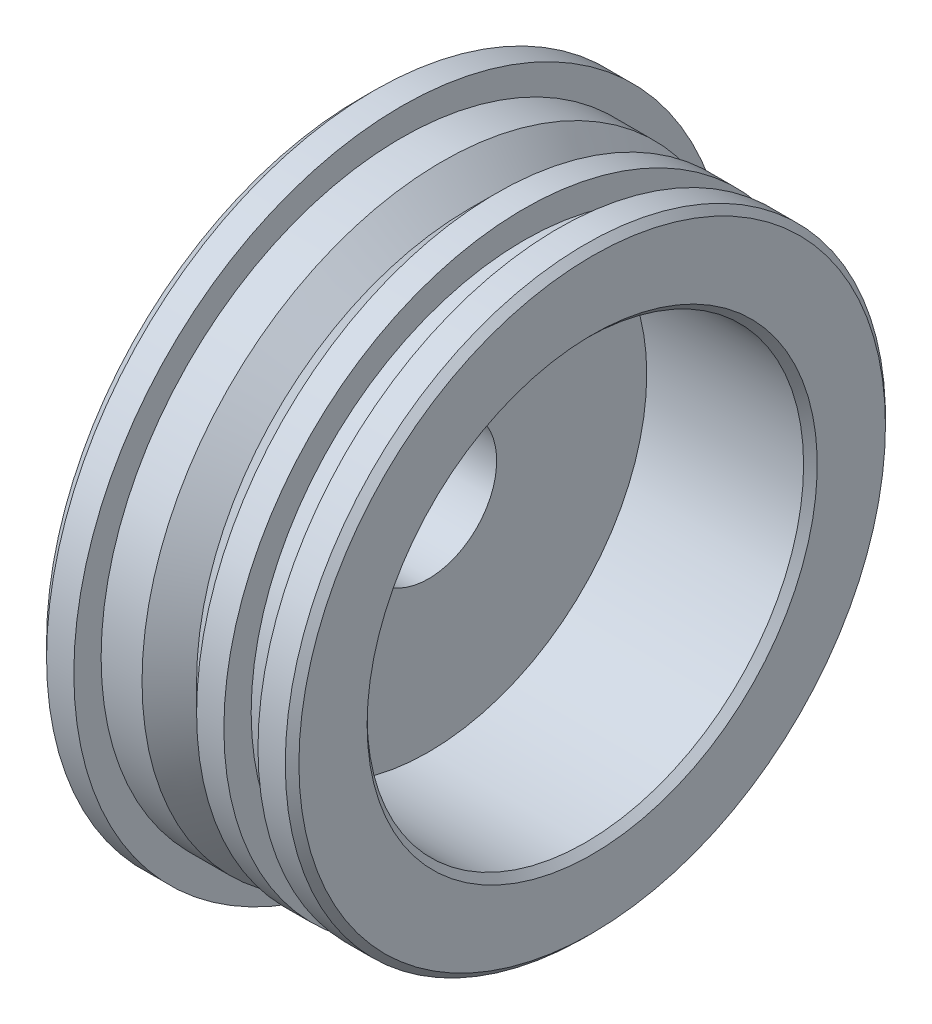
ISO-10303-21;
HEADER;
FILE_DESCRIPTION(('STEP AP214'),'2;1');
FILE_NAME('part.step','',(''),(''),'','','');
FILE_SCHEMA(('AUTOMOTIVE_DESIGN { 1 0 10303 214 1 1 1 1 }'));
ENDSEC;
DATA;
#1=APPLICATION_CONTEXT('core data for automotive mechanical design processes');
#2=APPLICATION_PROTOCOL_DEFINITION('international standard','automotive_design',2000,#1);
#3=PRODUCT_CONTEXT('',#1,'mechanical');
#4=PRODUCT('Part','Part','',(#3));
#5=PRODUCT_RELATED_PRODUCT_CATEGORY('part','',(#4));
#6=PRODUCT_DEFINITION_FORMATION('','',#4);
#7=PRODUCT_DEFINITION_CONTEXT('part definition',#1,'design');
#8=PRODUCT_DEFINITION('design','',#6,#7);
#9=PRODUCT_DEFINITION_SHAPE('','',#8);
#10=(LENGTH_UNIT() NAMED_UNIT(*) SI_UNIT(.MILLI.,.METRE.));
#11=(NAMED_UNIT(*) PLANE_ANGLE_UNIT() SI_UNIT($,.RADIAN.));
#12=(NAMED_UNIT(*) SI_UNIT($,.STERADIAN.) SOLID_ANGLE_UNIT());
#13=UNCERTAINTY_MEASURE_WITH_UNIT(LENGTH_MEASURE(1.E-05),#10,'distance_accuracy_value','');
#14=(GEOMETRIC_REPRESENTATION_CONTEXT(3) GLOBAL_UNCERTAINTY_ASSIGNED_CONTEXT((#13)) GLOBAL_UNIT_ASSIGNED_CONTEXT((#10,
#11,#12)) REPRESENTATION_CONTEXT('',''));
#15=CARTESIAN_POINT('',(0.,0.,0.));
#16=DIRECTION('',(0.,0.,1.));
#17=DIRECTION('',(1.,0.,0.));
#18=AXIS2_PLACEMENT_3D('',#15,#16,#17);
#19=CARTESIAN_POINT('',(-5.,0.,0.));
#20=DIRECTION('',(1.,0.,0.));
#21=DIRECTION('',(0.,0.,-1.));
#22=AXIS2_PLACEMENT_3D('',#19,#20,#21);
#23=PLANE('',#22);
#24=CARTESIAN_POINT('',(-5.,0.,0.));
#25=DIRECTION('',(-1.,0.,0.));
#26=DIRECTION('',(0.,0.,1.));
#27=AXIS2_PLACEMENT_3D('',#24,#25,#26);
#28=CIRCLE('',#27,5.);
#29=CARTESIAN_POINT('',(-5.,0.,5.));
#30=VERTEX_POINT('',#29);
#31=EDGE_CURVE('E90',#30,#30,#28,.T.);
#32=ORIENTED_EDGE('',*,*,#31,.F.);
#33=EDGE_LOOP('',(#32));
#34=FACE_BOUND('',#33,.T.);
#35=CARTESIAN_POINT('',(-5.,0.,0.));
#36=DIRECTION('',(-1.,0.,0.));
#37=DIRECTION('',(0.,0.,1.));
#38=AXIS2_PLACEMENT_3D('',#35,#36,#37);
#39=CIRCLE('',#38,23.);
#40=CARTESIAN_POINT('',(-5.,0.,23.));
#41=VERTEX_POINT('',#40);
#42=EDGE_CURVE('E10',#41,#41,#39,.T.);
#43=ORIENTED_EDGE('',*,*,#42,.T.);
#44=EDGE_LOOP('',(#43));
#45=FACE_BOUND('',#44,.T.);
#46=ADVANCED_FACE('F35',(#34,#45),#23,.F.);
#47=CARTESIAN_POINT('',(-4.,0.,0.));
#48=DIRECTION('',(1.,0.,0.));
#49=DIRECTION('',(0.,0.,-1.));
#50=AXIS2_PLACEMENT_3D('',#47,#48,#49);
#51=CONICAL_SURFACE('',#50,24.,0.785398163397449);
#52=ORIENTED_EDGE('',*,*,#42,.F.);
#53=EDGE_LOOP('',(#52));
#54=FACE_BOUND('',#53,.T.);
#55=CARTESIAN_POINT('',(-4.,0.,0.));
#56=DIRECTION('',(-1.,0.,0.));
#57=DIRECTION('',(0.,0.,1.));
#58=AXIS2_PLACEMENT_3D('',#55,#56,#57);
#59=CIRCLE('',#58,24.);
#60=CARTESIAN_POINT('',(-4.,0.,24.));
#61=VERTEX_POINT('',#60);
#62=EDGE_CURVE('E42',#61,#61,#59,.T.);
#63=ORIENTED_EDGE('',*,*,#62,.T.);
#64=EDGE_LOOP('',(#63));
#65=FACE_BOUND('',#64,.T.);
#66=ADVANCED_FACE('F109',(#54,#65),#51,.T.);
#67=CARTESIAN_POINT('',(0.,0.,0.));
#68=DIRECTION('',(-1.,0.,0.));
#69=DIRECTION('',(0.,0.,1.));
#70=AXIS2_PLACEMENT_3D('',#67,#68,#69);
#71=CYLINDRICAL_SURFACE('',#70,24.);
#72=ORIENTED_EDGE('',*,*,#62,.F.);
#73=EDGE_LOOP('',(#72));
#74=FACE_BOUND('',#73,.T.);
#75=CARTESIAN_POINT('',(-2.,0.,0.));
#76=DIRECTION('',(-1.,0.,0.));
#77=DIRECTION('',(0.,0.,1.));
#78=AXIS2_PLACEMENT_3D('',#75,#76,#77);
#79=CIRCLE('',#78,24.);
#80=CARTESIAN_POINT('',(-2.,0.,24.));
#81=VERTEX_POINT('',#80);
#82=EDGE_CURVE('E46',#81,#81,#79,.T.);
#83=ORIENTED_EDGE('',*,*,#82,.T.);
#84=EDGE_LOOP('',(#83));
#85=FACE_BOUND('',#84,.T.);
#86=ADVANCED_FACE('F114',(#74,#85),#71,.T.);
#87=CARTESIAN_POINT('',(-2.,24.,0.));
#88=DIRECTION('',(-1.,0.,0.));
#89=DIRECTION('',(0.,0.,1.));
#90=AXIS2_PLACEMENT_3D('',#87,#88,#89);
#91=PLANE('',#90);
#92=ORIENTED_EDGE('',*,*,#82,.F.);
#93=EDGE_LOOP('',(#92));
#94=FACE_BOUND('',#93,.T.);
#95=CARTESIAN_POINT('',(-2.,0.,0.));
#96=DIRECTION('',(-1.,0.,0.));
#97=DIRECTION('',(0.,0.,1.));
#98=AXIS2_PLACEMENT_3D('',#95,#96,#97);
#99=CIRCLE('',#98,22.);
#100=CARTESIAN_POINT('',(-2.,0.,22.));
#101=VERTEX_POINT('',#100);
#102=EDGE_CURVE('E51',#101,#101,#99,.T.);
#103=ORIENTED_EDGE('',*,*,#102,.T.);
#104=EDGE_LOOP('',(#103));
#105=FACE_BOUND('',#104,.T.);
#106=ADVANCED_FACE('F119',(#94,#105),#91,.F.);
#107=CARTESIAN_POINT('',(0.,0.,0.));
#108=DIRECTION('',(-1.,0.,0.));
#109=DIRECTION('',(0.,0.,1.));
#110=AXIS2_PLACEMENT_3D('',#107,#108,#109);
#111=CYLINDRICAL_SURFACE('',#110,22.);
#112=ORIENTED_EDGE('',*,*,#102,.F.);
#113=EDGE_LOOP('',(#112));
#114=FACE_BOUND('',#113,.T.);
#115=CARTESIAN_POINT('',(1.00000000000001,0.,0.));
#116=DIRECTION('',(-1.,0.,0.));
#117=DIRECTION('',(0.,0.,1.));
#118=AXIS2_PLACEMENT_3D('',#115,#116,#117);
#119=CIRCLE('',#118,22.);
#120=CARTESIAN_POINT('',(1.00000000000001,0.,22.));
#121=VERTEX_POINT('',#120);
#122=EDGE_CURVE('E54',#121,#121,#119,.T.);
#123=ORIENTED_EDGE('',*,*,#122,.T.);
#124=EDGE_LOOP('',(#123));
#125=FACE_BOUND('',#124,.T.);
#126=ADVANCED_FACE('F126',(#114,#125),#111,.T.);
#127=CARTESIAN_POINT('',(3.,0.,0.));
#128=DIRECTION('',(-1.,0.,0.));
#129=DIRECTION('',(0.,0.,1.));
#130=AXIS2_PLACEMENT_3D('',#127,#128,#129);
#131=CONICAL_SURFACE('',#130,20.,0.785398163397452);
#132=ORIENTED_EDGE('',*,*,#122,.F.);
#133=EDGE_LOOP('',(#132));
#134=FACE_BOUND('',#133,.T.);
#135=CARTESIAN_POINT('',(3.,0.,0.));
#136=DIRECTION('',(-1.,0.,0.));
#137=DIRECTION('',(0.,0.,1.));
#138=AXIS2_PLACEMENT_3D('',#135,#136,#137);
#139=CIRCLE('',#138,20.);
#140=CARTESIAN_POINT('',(3.,0.,20.));
#141=VERTEX_POINT('',#140);
#142=EDGE_CURVE('E57',#141,#141,#139,.T.);
#143=ORIENTED_EDGE('',*,*,#142,.T.);
#144=EDGE_LOOP('',(#143));
#145=FACE_BOUND('',#144,.T.);
#146=ADVANCED_FACE('F130',(#134,#145),#131,.T.);
#147=CARTESIAN_POINT('',(5.00000000000001,0.,0.));
#148=DIRECTION('',(1.,0.,0.));
#149=DIRECTION('',(0.,0.,-1.));
#150=AXIS2_PLACEMENT_3D('',#147,#148,#149);
#151=CONICAL_SURFACE('',#150,22.,0.785398163397446);
#152=ORIENTED_EDGE('',*,*,#142,.F.);
#153=EDGE_LOOP('',(#152));
#154=FACE_BOUND('',#153,.T.);
#155=CARTESIAN_POINT('',(5.00000000000001,0.,0.));
#156=DIRECTION('',(-1.,0.,0.));
#157=DIRECTION('',(0.,0.,1.));
#158=AXIS2_PLACEMENT_3D('',#155,#156,#157);
#159=CIRCLE('',#158,22.);
#160=CARTESIAN_POINT('',(5.00000000000001,0.,22.));
#161=VERTEX_POINT('',#160);
#162=EDGE_CURVE('E60',#161,#161,#159,.T.);
#163=ORIENTED_EDGE('',*,*,#162,.T.);
#164=EDGE_LOOP('',(#163));
#165=FACE_BOUND('',#164,.T.);
#166=ADVANCED_FACE('F134',(#154,#165),#151,.T.);
#167=CARTESIAN_POINT('',(0.,0.,0.));
#168=DIRECTION('',(-1.,0.,0.));
#169=DIRECTION('',(0.,0.,1.));
#170=AXIS2_PLACEMENT_3D('',#167,#168,#169);
#171=CYLINDRICAL_SURFACE('',#170,22.);
#172=ORIENTED_EDGE('',*,*,#162,.F.);
#173=EDGE_LOOP('',(#172));
#174=FACE_BOUND('',#173,.T.);
#175=CARTESIAN_POINT('',(7.00000000000001,0.,0.));
#176=DIRECTION('',(-1.,0.,0.));
#177=DIRECTION('',(0.,0.,1.));
#178=AXIS2_PLACEMENT_3D('',#175,#176,#177);
#179=CIRCLE('',#178,22.);
#180=CARTESIAN_POINT('',(7.00000000000001,0.,22.));
#181=VERTEX_POINT('',#180);
#182=EDGE_CURVE('E63',#181,#181,#179,.T.);
#183=ORIENTED_EDGE('',*,*,#182,.T.);
#184=EDGE_LOOP('',(#183));
#185=FACE_BOUND('',#184,.T.);
#186=ADVANCED_FACE('F138',(#174,#185),#171,.T.);
#187=CARTESIAN_POINT('',(7.00000000000001,22.,0.));
#188=DIRECTION('',(-1.,0.,0.));
#189=DIRECTION('',(0.,0.,1.));
#190=AXIS2_PLACEMENT_3D('',#187,#188,#189);
#191=PLANE('',#190);
#192=ORIENTED_EDGE('',*,*,#182,.F.);
#193=EDGE_LOOP('',(#192));
#194=FACE_BOUND('',#193,.T.);
#195=CARTESIAN_POINT('',(7.00000000000001,0.,0.));
#196=DIRECTION('',(-1.,0.,0.));
#197=DIRECTION('',(0.,0.,1.));
#198=AXIS2_PLACEMENT_3D('',#195,#196,#197);
#199=CIRCLE('',#198,20.);
#200=CARTESIAN_POINT('',(7.00000000000001,0.,20.));
#201=VERTEX_POINT('',#200);
#202=EDGE_CURVE('E66',#201,#201,#199,.T.);
#203=ORIENTED_EDGE('',*,*,#202,.T.);
#204=EDGE_LOOP('',(#203));
#205=FACE_BOUND('',#204,.T.);
#206=ADVANCED_FACE('F142',(#194,#205),#191,.F.);
#207=CARTESIAN_POINT('',(0.,0.,0.));
#208=DIRECTION('',(-1.,0.,0.));
#209=DIRECTION('',(0.,0.,1.));
#210=AXIS2_PLACEMENT_3D('',#207,#208,#209);
#211=CYLINDRICAL_SURFACE('',#210,20.);
#212=ORIENTED_EDGE('',*,*,#202,.F.);
#213=EDGE_LOOP('',(#212));
#214=FACE_BOUND('',#213,.T.);
#215=CARTESIAN_POINT('',(9.50000000000001,0.,0.));
#216=DIRECTION('',(-1.,0.,0.));
#217=DIRECTION('',(0.,0.,1.));
#218=AXIS2_PLACEMENT_3D('',#215,#216,#217);
#219=CIRCLE('',#218,20.);
#220=CARTESIAN_POINT('',(9.50000000000001,0.,20.));
#221=VERTEX_POINT('',#220);
#222=EDGE_CURVE('E69',#221,#221,#219,.T.);
#223=ORIENTED_EDGE('',*,*,#222,.T.);
#224=EDGE_LOOP('',(#223));
#225=FACE_BOUND('',#224,.T.);
#226=ADVANCED_FACE('F146',(#214,#225),#211,.T.);
#227=CARTESIAN_POINT('',(9.50000000000001,20.,0.));
#228=DIRECTION('',(1.,0.,0.));
#229=DIRECTION('',(0.,0.,-1.));
#230=AXIS2_PLACEMENT_3D('',#227,#228,#229);
#231=PLANE('',#230);
#232=ORIENTED_EDGE('',*,*,#222,.F.);
#233=EDGE_LOOP('',(#232));
#234=FACE_BOUND('',#233,.T.);
#235=CARTESIAN_POINT('',(9.50000000000001,0.,0.));
#236=DIRECTION('',(-1.,0.,0.));
#237=DIRECTION('',(0.,0.,1.));
#238=AXIS2_PLACEMENT_3D('',#235,#236,#237);
#239=CIRCLE('',#238,22.);
#240=CARTESIAN_POINT('',(9.50000000000001,0.,22.));
#241=VERTEX_POINT('',#240);
#242=EDGE_CURVE('E72',#241,#241,#239,.T.);
#243=ORIENTED_EDGE('',*,*,#242,.T.);
#244=EDGE_LOOP('',(#243));
#245=FACE_BOUND('',#244,.T.);
#246=ADVANCED_FACE('F150',(#234,#245),#231,.F.);
#247=CARTESIAN_POINT('',(0.,0.,0.));
#248=DIRECTION('',(-1.,0.,0.));
#249=DIRECTION('',(0.,0.,1.));
#250=AXIS2_PLACEMENT_3D('',#247,#248,#249);
#251=CYLINDRICAL_SURFACE('',#250,22.);
#252=ORIENTED_EDGE('',*,*,#242,.F.);
#253=EDGE_LOOP('',(#252));
#254=FACE_BOUND('',#253,.T.);
#255=CARTESIAN_POINT('',(11.5,0.,0.));
#256=DIRECTION('',(-1.,0.,0.));
#257=DIRECTION('',(0.,0.,1.));
#258=AXIS2_PLACEMENT_3D('',#255,#256,#257);
#259=CIRCLE('',#258,22.);
#260=CARTESIAN_POINT('',(11.5,0.,22.));
#261=VERTEX_POINT('',#260);
#262=EDGE_CURVE('E75',#261,#261,#259,.T.);
#263=ORIENTED_EDGE('',*,*,#262,.T.);
#264=EDGE_LOOP('',(#263));
#265=FACE_BOUND('',#264,.T.);
#266=ADVANCED_FACE('F154',(#254,#265),#251,.T.);
#267=CARTESIAN_POINT('',(12.,0.,0.));
#268=DIRECTION('',(-1.,0.,0.));
#269=DIRECTION('',(0.,0.,1.));
#270=AXIS2_PLACEMENT_3D('',#267,#268,#269);
#271=CONICAL_SURFACE('',#270,21.5,0.78539816339745);
#272=ORIENTED_EDGE('',*,*,#262,.F.);
#273=EDGE_LOOP('',(#272));
#274=FACE_BOUND('',#273,.T.);
#275=CARTESIAN_POINT('',(12.,0.,0.));
#276=DIRECTION('',(-1.,0.,0.));
#277=DIRECTION('',(0.,0.,1.));
#278=AXIS2_PLACEMENT_3D('',#275,#276,#277);
#279=CIRCLE('',#278,21.5);
#280=CARTESIAN_POINT('',(12.,0.,21.5));
#281=VERTEX_POINT('',#280);
#282=EDGE_CURVE('E78',#281,#281,#279,.T.);
#283=ORIENTED_EDGE('',*,*,#282,.T.);
#284=EDGE_LOOP('',(#283));
#285=FACE_BOUND('',#284,.T.);
#286=ADVANCED_FACE('F158',(#274,#285),#271,.T.);
#287=CARTESIAN_POINT('',(12.,21.5,0.));
#288=DIRECTION('',(-1.,0.,0.));
#289=DIRECTION('',(0.,0.,1.));
#290=AXIS2_PLACEMENT_3D('',#287,#288,#289);
#291=PLANE('',#290);
#292=ORIENTED_EDGE('',*,*,#282,.F.);
#293=EDGE_LOOP('',(#292));
#294=FACE_BOUND('',#293,.T.);
#295=CARTESIAN_POINT('',(12.,0.,0.));
#296=DIRECTION('',(-1.,0.,0.));
#297=DIRECTION('',(0.,0.,1.));
#298=AXIS2_PLACEMENT_3D('',#295,#296,#297);
#299=CIRCLE('',#298,16.5);
#300=CARTESIAN_POINT('',(12.,0.,16.5));
#301=VERTEX_POINT('',#300);
#302=EDGE_CURVE('E81',#301,#301,#299,.T.);
#303=ORIENTED_EDGE('',*,*,#302,.T.);
#304=EDGE_LOOP('',(#303));
#305=FACE_BOUND('',#304,.T.);
#306=ADVANCED_FACE('F162',(#294,#305),#291,.F.);
#307=CARTESIAN_POINT('',(11.5,0.,0.));
#308=DIRECTION('',(1.,0.,0.));
#309=DIRECTION('',(0.,0.,-1.));
#310=AXIS2_PLACEMENT_3D('',#307,#308,#309);
#311=CONICAL_SURFACE('',#310,16.,0.785398163397448);
#312=ORIENTED_EDGE('',*,*,#302,.F.);
#313=EDGE_LOOP('',(#312));
#314=FACE_BOUND('',#313,.T.);
#315=CARTESIAN_POINT('',(11.5,0.,0.));
#316=DIRECTION('',(-1.,0.,0.));
#317=DIRECTION('',(0.,0.,1.));
#318=AXIS2_PLACEMENT_3D('',#315,#316,#317);
#319=CIRCLE('',#318,16.);
#320=CARTESIAN_POINT('',(11.5,0.,16.));
#321=VERTEX_POINT('',#320);
#322=EDGE_CURVE('E84',#321,#321,#319,.T.);
#323=ORIENTED_EDGE('',*,*,#322,.T.);
#324=EDGE_LOOP('',(#323));
#325=FACE_BOUND('',#324,.T.);
#326=ADVANCED_FACE('F166',(#314,#325),#311,.F.);
#327=CARTESIAN_POINT('',(0.,0.,0.));
#328=DIRECTION('',(-1.,0.,0.));
#329=DIRECTION('',(0.,0.,1.));
#330=AXIS2_PLACEMENT_3D('',#327,#328,#329);
#331=CYLINDRICAL_SURFACE('',#330,16.);
#332=ORIENTED_EDGE('',*,*,#322,.F.);
#333=EDGE_LOOP('',(#332));
#334=FACE_BOUND('',#333,.T.);
#335=CARTESIAN_POINT('',(0.,0.,0.));
#336=DIRECTION('',(-1.,0.,0.));
#337=DIRECTION('',(0.,0.,1.));
#338=AXIS2_PLACEMENT_3D('',#335,#336,#337);
#339=CIRCLE('',#338,16.);
#340=CARTESIAN_POINT('',(0.,0.,16.));
#341=VERTEX_POINT('',#340);
#342=EDGE_CURVE('E87',#341,#341,#339,.T.);
#343=ORIENTED_EDGE('',*,*,#342,.T.);
#344=EDGE_LOOP('',(#343));
#345=FACE_BOUND('',#344,.T.);
#346=ADVANCED_FACE('F106',(#334,#345),#331,.F.);
#347=CARTESIAN_POINT('',(0.,16.,0.));
#348=DIRECTION('',(-1.,0.,0.));
#349=DIRECTION('',(0.,0.,1.));
#350=AXIS2_PLACEMENT_3D('',#347,#348,#349);
#351=PLANE('',#350);
#352=CARTESIAN_POINT('',(0.,0.,0.));
#353=DIRECTION('',(-1.,0.,0.));
#354=DIRECTION('',(0.,0.,1.));
#355=AXIS2_PLACEMENT_3D('',#352,#353,#354);
#356=CIRCLE('',#355,5.);
#357=CARTESIAN_POINT('',(0.,0.,5.));
#358=VERTEX_POINT('',#357);
#359=EDGE_CURVE('E38',#358,#358,#356,.T.);
#360=ORIENTED_EDGE('',*,*,#359,.T.);
#361=EDGE_LOOP('',(#360));
#362=FACE_BOUND('',#361,.T.);
#363=ORIENTED_EDGE('',*,*,#342,.F.);
#364=EDGE_LOOP('',(#363));
#365=FACE_BOUND('',#364,.T.);
#366=ADVANCED_FACE('F97',(#362,#365),#351,.F.);
#367=CARTESIAN_POINT('',(5.,0.,0.));
#368=DIRECTION('',(-1.,0.,0.));
#369=DIRECTION('',(0.,0.,1.));
#370=AXIS2_PLACEMENT_3D('',#367,#368,#369);
#371=CYLINDRICAL_SURFACE('',#370,5.);
#372=ORIENTED_EDGE('',*,*,#31,.T.);
#373=EDGE_LOOP('',(#372));
#374=FACE_BOUND('',#373,.T.);
#375=ORIENTED_EDGE('',*,*,#359,.F.);
#376=EDGE_LOOP('',(#375));
#377=FACE_BOUND('',#376,.T.);
#378=ADVANCED_FACE('F100',(#374,#377),#371,.F.);
#379=CLOSED_SHELL('',(#46,#66,#86,#106,#126,#146,#166,#186,#206,#226,#246,#266,#286,#306,#326,
#346,#366,#378));
#380=MANIFOLD_SOLID_BREP('B2',#379);
#381=ADVANCED_BREP_SHAPE_REPRESENTATION('',(#18,#380),#14);
#382=SHAPE_DEFINITION_REPRESENTATION(#9,#381);
ENDSEC;
END-ISO-10303-21;
